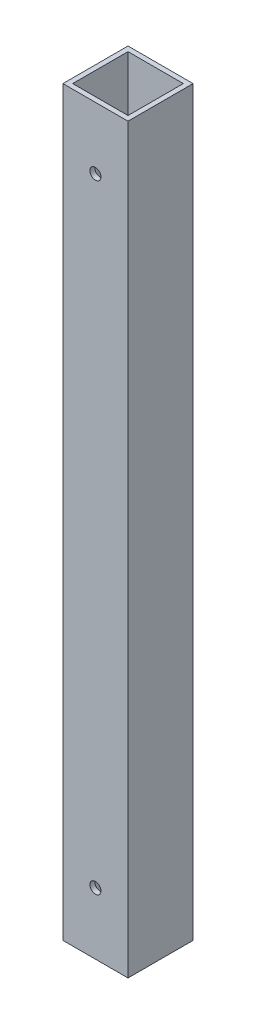
ISO-10303-21;
HEADER;
FILE_DESCRIPTION(('STEP AP214'),'2;1');
FILE_NAME('part.step','',(''),(''),'','','');
FILE_SCHEMA(('AUTOMOTIVE_DESIGN { 1 0 10303 214 1 1 1 1 }'));
ENDSEC;
DATA;
#1=APPLICATION_CONTEXT('core data for automotive mechanical design processes');
#2=APPLICATION_PROTOCOL_DEFINITION('international standard','automotive_design',2000,#1);
#3=PRODUCT_CONTEXT('',#1,'mechanical');
#4=PRODUCT('Part','Part','',(#3));
#5=PRODUCT_RELATED_PRODUCT_CATEGORY('part','',(#4));
#6=PRODUCT_DEFINITION_FORMATION('','',#4);
#7=PRODUCT_DEFINITION_CONTEXT('part definition',#1,'design');
#8=PRODUCT_DEFINITION('design','',#6,#7);
#9=PRODUCT_DEFINITION_SHAPE('','',#8);
#10=(LENGTH_UNIT() NAMED_UNIT(*) SI_UNIT(.MILLI.,.METRE.));
#11=(NAMED_UNIT(*) PLANE_ANGLE_UNIT() SI_UNIT($,.RADIAN.));
#12=(NAMED_UNIT(*) SI_UNIT($,.STERADIAN.) SOLID_ANGLE_UNIT());
#13=UNCERTAINTY_MEASURE_WITH_UNIT(LENGTH_MEASURE(1.E-05),#10,'distance_accuracy_value','');
#14=(GEOMETRIC_REPRESENTATION_CONTEXT(3) GLOBAL_UNCERTAINTY_ASSIGNED_CONTEXT((#13)) GLOBAL_UNIT_ASSIGNED_CONTEXT((#10,
#11,#12)) REPRESENTATION_CONTEXT('',''));
#15=CARTESIAN_POINT('',(0.,0.,0.));
#16=DIRECTION('',(0.,0.,1.));
#17=DIRECTION('',(1.,0.,0.));
#18=AXIS2_PLACEMENT_3D('',#15,#16,#17);
#19=CARTESIAN_POINT('',(0.,95.,-11.));
#20=DIRECTION('',(0.,0.,1.));
#21=DIRECTION('',(1.,0.,0.));
#22=AXIS2_PLACEMENT_3D('',#19,#20,#21);
#23=CYLINDRICAL_SURFACE('',#22,1.7);
#24=DIRECTION('',(0.,0.,1.));
#25=VECTOR('',#24,1.);
#26=CARTESIAN_POINT('',(1.7,95.,-11.));
#27=LINE('',#26,#25);
#28=CARTESIAN_POINT('',(1.7,95.,-10.));
#29=VERTEX_POINT('',#28);
#30=CARTESIAN_POINT('',(1.7,95.,-8.5));
#31=VERTEX_POINT('',#30);
#32=EDGE_CURVE('E9',#29,#31,#27,.T.);
#33=ORIENTED_EDGE('',*,*,#32,.F.);
#34=CARTESIAN_POINT('',(0.,95.,-10.));
#35=DIRECTION('',(0.,0.,1.));
#36=DIRECTION('',(1.,0.,0.));
#37=AXIS2_PLACEMENT_3D('',#34,#35,#36);
#38=CIRCLE('',#37,1.7);
#39=EDGE_CURVE('E134',#29,#29,#38,.T.);
#40=ORIENTED_EDGE('',*,*,#39,.F.);
#41=ORIENTED_EDGE('',*,*,#32,.T.);
#42=CARTESIAN_POINT('',(0.,95.,-8.5));
#43=DIRECTION('',(0.,0.,1.));
#44=DIRECTION('',(1.,0.,0.));
#45=AXIS2_PLACEMENT_3D('',#42,#43,#44);
#46=CIRCLE('',#45,1.7);
#47=EDGE_CURVE('E136',#31,#31,#46,.T.);
#48=ORIENTED_EDGE('',*,*,#47,.T.);
#49=EDGE_LOOP('',(#33,#40,#41,#48));
#50=FACE_BOUND('',#49,.T.);
#51=ADVANCED_FACE('F14',(#50),#23,.F.);
#52=CARTESIAN_POINT('',(0.,-95.,-11.));
#53=DIRECTION('',(0.,0.,1.));
#54=DIRECTION('',(1.,0.,0.));
#55=AXIS2_PLACEMENT_3D('',#52,#53,#54);
#56=CYLINDRICAL_SURFACE('',#55,1.7);
#57=DIRECTION('',(0.,0.,1.));
#58=VECTOR('',#57,1.);
#59=CARTESIAN_POINT('',(1.7,-95.,-11.));
#60=LINE('',#59,#58);
#61=CARTESIAN_POINT('',(1.7,-95.,-10.));
#62=VERTEX_POINT('',#61);
#63=CARTESIAN_POINT('',(1.7,-95.,-8.5));
#64=VERTEX_POINT('',#63);
#65=EDGE_CURVE('E25',#62,#64,#60,.T.);
#66=ORIENTED_EDGE('',*,*,#65,.F.);
#67=CARTESIAN_POINT('',(0.,-95.,-10.));
#68=DIRECTION('',(0.,0.,1.));
#69=DIRECTION('',(1.,0.,0.));
#70=AXIS2_PLACEMENT_3D('',#67,#68,#69);
#71=CIRCLE('',#70,1.7);
#72=EDGE_CURVE('E140',#62,#62,#71,.T.);
#73=ORIENTED_EDGE('',*,*,#72,.F.);
#74=ORIENTED_EDGE('',*,*,#65,.T.);
#75=CARTESIAN_POINT('',(0.,-95.,-8.5));
#76=DIRECTION('',(0.,0.,1.));
#77=DIRECTION('',(1.,0.,0.));
#78=AXIS2_PLACEMENT_3D('',#75,#76,#77);
#79=CIRCLE('',#78,1.7);
#80=EDGE_CURVE('E229',#64,#64,#79,.T.);
#81=ORIENTED_EDGE('',*,*,#80,.T.);
#82=EDGE_LOOP('',(#66,#73,#74,#81));
#83=FACE_BOUND('',#82,.T.);
#84=ADVANCED_FACE('F395',(#83),#56,.F.);
#85=CARTESIAN_POINT('',(0.,95.,-11.));
#86=DIRECTION('',(0.,0.,1.));
#87=DIRECTION('',(1.,0.,0.));
#88=AXIS2_PLACEMENT_3D('',#85,#86,#87);
#89=CYLINDRICAL_SURFACE('',#88,1.7);
#90=DIRECTION('',(0.,0.,1.));
#91=VECTOR('',#90,1.);
#92=CARTESIAN_POINT('',(1.7,95.,-11.));
#93=LINE('',#92,#91);
#94=CARTESIAN_POINT('',(1.7,95.,8.5));
#95=VERTEX_POINT('',#94);
#96=CARTESIAN_POINT('',(1.7,95.,10.));
#97=VERTEX_POINT('',#96);
#98=EDGE_CURVE('E193',#95,#97,#93,.T.);
#99=ORIENTED_EDGE('',*,*,#98,.F.);
#100=CARTESIAN_POINT('',(0.,95.,8.5));
#101=DIRECTION('',(0.,0.,1.));
#102=DIRECTION('',(1.,0.,0.));
#103=AXIS2_PLACEMENT_3D('',#100,#101,#102);
#104=CIRCLE('',#103,1.7);
#105=EDGE_CURVE('E199',#95,#95,#104,.T.);
#106=ORIENTED_EDGE('',*,*,#105,.F.);
#107=ORIENTED_EDGE('',*,*,#98,.T.);
#108=CARTESIAN_POINT('',(0.,95.,10.));
#109=DIRECTION('',(0.,0.,1.));
#110=DIRECTION('',(1.,0.,0.));
#111=AXIS2_PLACEMENT_3D('',#108,#109,#110);
#112=CIRCLE('',#111,1.7);
#113=EDGE_CURVE('E18',#97,#97,#112,.T.);
#114=ORIENTED_EDGE('',*,*,#113,.T.);
#115=EDGE_LOOP('',(#99,#106,#107,#114));
#116=FACE_BOUND('',#115,.T.);
#117=ADVANCED_FACE('F399',(#116),#89,.F.);
#118=CARTESIAN_POINT('',(0.,-95.,-11.));
#119=DIRECTION('',(0.,0.,1.));
#120=DIRECTION('',(1.,0.,0.));
#121=AXIS2_PLACEMENT_3D('',#118,#119,#120);
#122=CYLINDRICAL_SURFACE('',#121,1.7);
#123=DIRECTION('',(0.,0.,1.));
#124=VECTOR('',#123,1.);
#125=CARTESIAN_POINT('',(1.7,-95.,-11.));
#126=LINE('',#125,#124);
#127=CARTESIAN_POINT('',(1.7,-95.,8.5));
#128=VERTEX_POINT('',#127);
#129=CARTESIAN_POINT('',(1.7,-95.,10.));
#130=VERTEX_POINT('',#129);
#131=EDGE_CURVE('E208',#128,#130,#126,.T.);
#132=ORIENTED_EDGE('',*,*,#131,.F.);
#133=CARTESIAN_POINT('',(0.,-95.,8.5));
#134=DIRECTION('',(0.,0.,1.));
#135=DIRECTION('',(1.,0.,0.));
#136=AXIS2_PLACEMENT_3D('',#133,#134,#135);
#137=CIRCLE('',#136,1.7);
#138=EDGE_CURVE('E190',#128,#128,#137,.T.);
#139=ORIENTED_EDGE('',*,*,#138,.F.);
#140=ORIENTED_EDGE('',*,*,#131,.T.);
#141=CARTESIAN_POINT('',(0.,-95.,10.));
#142=DIRECTION('',(0.,0.,1.));
#143=DIRECTION('',(1.,0.,0.));
#144=AXIS2_PLACEMENT_3D('',#141,#142,#143);
#145=CIRCLE('',#144,1.7);
#146=EDGE_CURVE('E169',#130,#130,#145,.T.);
#147=ORIENTED_EDGE('',*,*,#146,.T.);
#148=EDGE_LOOP('',(#132,#139,#140,#147));
#149=FACE_BOUND('',#148,.T.);
#150=ADVANCED_FACE('F409',(#149),#122,.F.);
#151=CARTESIAN_POINT('',(-8.5,-114.5,-8.5));
#152=DIRECTION('',(1.,0.,0.));
#153=DIRECTION('',(0.,1.,0.));
#154=AXIS2_PLACEMENT_3D('',#151,#152,#153);
#155=PLANE('',#154);
#156=DIRECTION('',(0.,1.,0.));
#157=VECTOR('',#156,1.);
#158=CARTESIAN_POINT('',(-8.5,-114.5,8.5));
#159=LINE('',#158,#157);
#160=CARTESIAN_POINT('',(-8.5,-114.,8.5));
#161=VERTEX_POINT('',#160);
#162=CARTESIAN_POINT('',(-8.5,114.,8.5));
#163=VERTEX_POINT('',#162);
#164=EDGE_CURVE('E96',#161,#163,#159,.T.);
#165=ORIENTED_EDGE('',*,*,#164,.F.);
#166=DIRECTION('',(0.,0.,-1.));
#167=VECTOR('',#166,1.);
#168=CARTESIAN_POINT('',(-8.5,-114.,-9.25));
#169=LINE('',#168,#167);
#170=CARTESIAN_POINT('',(-8.5,-114.,-8.5));
#171=VERTEX_POINT('',#170);
#172=EDGE_CURVE('E163',#161,#171,#169,.T.);
#173=ORIENTED_EDGE('',*,*,#172,.T.);
#174=DIRECTION('',(0.,1.,0.));
#175=VECTOR('',#174,1.);
#176=CARTESIAN_POINT('',(-8.5,-114.5,-8.5));
#177=LINE('',#176,#175);
#178=CARTESIAN_POINT('',(-8.5,114.,-8.5));
#179=VERTEX_POINT('',#178);
#180=EDGE_CURVE('E226',#171,#179,#177,.T.);
#181=ORIENTED_EDGE('',*,*,#180,.T.);
#182=DIRECTION('',(0.,0.,-1.));
#183=VECTOR('',#182,1.);
#184=CARTESIAN_POINT('',(-8.5,114.,-9.25));
#185=LINE('',#184,#183);
#186=EDGE_CURVE('E158',#163,#179,#185,.T.);
#187=ORIENTED_EDGE('',*,*,#186,.F.);
#188=EDGE_LOOP('',(#165,#173,#181,#187));
#189=FACE_BOUND('',#188,.T.);
#190=ADVANCED_FACE('F404',(#189),#155,.T.);
#191=CARTESIAN_POINT('',(-8.5,-114.5,-8.5));
#192=DIRECTION('',(0.,0.,1.));
#193=DIRECTION('',(1.,0.,0.));
#194=AXIS2_PLACEMENT_3D('',#191,#192,#193);
#195=PLANE('',#194);
#196=ORIENTED_EDGE('',*,*,#47,.F.);
#197=EDGE_LOOP('',(#196));
#198=FACE_BOUND('',#197,.T.);
#199=ORIENTED_EDGE('',*,*,#80,.F.);
#200=EDGE_LOOP('',(#199));
#201=FACE_BOUND('',#200,.T.);
#202=ORIENTED_EDGE('',*,*,#180,.F.);
#203=DIRECTION('',(1.,0.,0.));
#204=VECTOR('',#203,1.);
#205=CARTESIAN_POINT('',(-9.25,-114.,-8.5));
#206=LINE('',#205,#204);
#207=CARTESIAN_POINT('',(8.5,-114.,-8.5));
#208=VERTEX_POINT('',#207);
#209=EDGE_CURVE('E168',#171,#208,#206,.T.);
#210=ORIENTED_EDGE('',*,*,#209,.T.);
#211=DIRECTION('',(0.,1.,0.));
#212=VECTOR('',#211,1.);
#213=CARTESIAN_POINT('',(8.5,-114.5,-8.5));
#214=LINE('',#213,#212);
#215=CARTESIAN_POINT('',(8.5,114.,-8.5));
#216=VERTEX_POINT('',#215);
#217=EDGE_CURVE('E203',#208,#216,#214,.T.);
#218=ORIENTED_EDGE('',*,*,#217,.T.);
#219=DIRECTION('',(1.,0.,0.));
#220=VECTOR('',#219,1.);
#221=CARTESIAN_POINT('',(-9.25,114.,-8.5));
#222=LINE('',#221,#220);
#223=EDGE_CURVE('E153',#179,#216,#222,.T.);
#224=ORIENTED_EDGE('',*,*,#223,.F.);
#225=EDGE_LOOP('',(#202,#210,#218,#224));
#226=FACE_BOUND('',#225,.T.);
#227=ADVANCED_FACE('F408',(#198,#201,#226),#195,.T.);
#228=CARTESIAN_POINT('',(8.5,-114.5,-8.5));
#229=DIRECTION('',(1.,0.,0.));
#230=DIRECTION('',(0.,1.,0.));
#231=AXIS2_PLACEMENT_3D('',#228,#229,#230);
#232=PLANE('',#231);
#233=DIRECTION('',(0.,0.,-1.));
#234=VECTOR('',#233,1.);
#235=CARTESIAN_POINT('',(8.5,114.,-9.25));
#236=LINE('',#235,#234);
#237=CARTESIAN_POINT('',(8.5,114.,8.5));
#238=VERTEX_POINT('',#237);
#239=EDGE_CURVE('E157',#238,#216,#236,.T.);
#240=ORIENTED_EDGE('',*,*,#239,.T.);
#241=ORIENTED_EDGE('',*,*,#217,.F.);
#242=DIRECTION('',(0.,0.,-1.));
#243=VECTOR('',#242,1.);
#244=CARTESIAN_POINT('',(8.5,-114.,-9.25));
#245=LINE('',#244,#243);
#246=CARTESIAN_POINT('',(8.5,-114.,8.5));
#247=VERTEX_POINT('',#246);
#248=EDGE_CURVE('E177',#247,#208,#245,.T.);
#249=ORIENTED_EDGE('',*,*,#248,.F.);
#250=DIRECTION('',(0.,1.,0.));
#251=VECTOR('',#250,1.);
#252=CARTESIAN_POINT('',(8.5,-114.5,8.5));
#253=LINE('',#252,#251);
#254=EDGE_CURVE('E80',#247,#238,#253,.T.);
#255=ORIENTED_EDGE('',*,*,#254,.T.);
#256=EDGE_LOOP('',(#240,#241,#249,#255));
#257=FACE_BOUND('',#256,.T.);
#258=ADVANCED_FACE('F462',(#257),#232,.F.);
#259=CARTESIAN_POINT('',(-8.5,-114.5,8.5));
#260=DIRECTION('',(0.,0.,1.));
#261=DIRECTION('',(1.,0.,0.));
#262=AXIS2_PLACEMENT_3D('',#259,#260,#261);
#263=PLANE('',#262);
#264=ORIENTED_EDGE('',*,*,#105,.T.);
#265=EDGE_LOOP('',(#264));
#266=FACE_BOUND('',#265,.T.);
#267=ORIENTED_EDGE('',*,*,#138,.T.);
#268=EDGE_LOOP('',(#267));
#269=FACE_BOUND('',#268,.T.);
#270=DIRECTION('',(1.,0.,0.));
#271=VECTOR('',#270,1.);
#272=CARTESIAN_POINT('',(-9.25,114.,8.5));
#273=LINE('',#272,#271);
#274=EDGE_CURVE('E159',#163,#238,#273,.T.);
#275=ORIENTED_EDGE('',*,*,#274,.T.);
#276=ORIENTED_EDGE('',*,*,#254,.F.);
#277=DIRECTION('',(1.,0.,0.));
#278=VECTOR('',#277,1.);
#279=CARTESIAN_POINT('',(-9.25,-114.,8.5));
#280=LINE('',#279,#278);
#281=EDGE_CURVE('E167',#161,#247,#280,.T.);
#282=ORIENTED_EDGE('',*,*,#281,.F.);
#283=ORIENTED_EDGE('',*,*,#164,.T.);
#284=EDGE_LOOP('',(#275,#276,#282,#283));
#285=FACE_BOUND('',#284,.T.);
#286=ADVANCED_FACE('F426',(#266,#269,#285),#263,.F.);
#287=CARTESIAN_POINT('',(10.,-114.,-10.));
#288=DIRECTION('',(1.,0.,0.));
#289=DIRECTION('',(0.,1.,0.));
#290=AXIS2_PLACEMENT_3D('',#287,#288,#289);
#291=PLANE('',#290);
#292=DIRECTION('',(0.,0.,1.));
#293=VECTOR('',#292,1.);
#294=CARTESIAN_POINT('',(10.,-114.,-10.));
#295=LINE('',#294,#293);
#296=CARTESIAN_POINT('',(10.,-114.,-10.));
#297=VERTEX_POINT('',#296);
#298=CARTESIAN_POINT('',(10.,-114.,10.));
#299=VERTEX_POINT('',#298);
#300=EDGE_CURVE('E178',#297,#299,#295,.T.);
#301=ORIENTED_EDGE('',*,*,#300,.F.);
#302=DIRECTION('',(0.,1.,0.));
#303=VECTOR('',#302,1.);
#304=CARTESIAN_POINT('',(10.,-114.,-10.));
#305=LINE('',#304,#303);
#306=CARTESIAN_POINT('',(10.,114.,-10.));
#307=VERTEX_POINT('',#306);
#308=EDGE_CURVE('E149',#297,#307,#305,.T.);
#309=ORIENTED_EDGE('',*,*,#308,.T.);
#310=DIRECTION('',(0.,0.,1.));
#311=VECTOR('',#310,1.);
#312=CARTESIAN_POINT('',(10.,114.,-10.));
#313=LINE('',#312,#311);
#314=CARTESIAN_POINT('',(10.,114.,10.));
#315=VERTEX_POINT('',#314);
#316=EDGE_CURVE('E162',#307,#315,#313,.T.);
#317=ORIENTED_EDGE('',*,*,#316,.T.);
#318=DIRECTION('',(0.,1.,0.));
#319=VECTOR('',#318,1.);
#320=CARTESIAN_POINT('',(10.,-114.,10.));
#321=LINE('',#320,#319);
#322=EDGE_CURVE('E235',#299,#315,#321,.T.);
#323=ORIENTED_EDGE('',*,*,#322,.F.);
#324=EDGE_LOOP('',(#301,#309,#317,#323));
#325=FACE_BOUND('',#324,.T.);
#326=ADVANCED_FACE('F270',(#325),#291,.T.);
#327=CARTESIAN_POINT('',(-10.,-114.,-10.));
#328=DIRECTION('',(0.,0.,1.));
#329=DIRECTION('',(1.,0.,0.));
#330=AXIS2_PLACEMENT_3D('',#327,#328,#329);
#331=PLANE('',#330);
#332=ORIENTED_EDGE('',*,*,#39,.T.);
#333=EDGE_LOOP('',(#332));
#334=FACE_BOUND('',#333,.T.);
#335=ORIENTED_EDGE('',*,*,#72,.T.);
#336=EDGE_LOOP('',(#335));
#337=FACE_BOUND('',#336,.T.);
#338=DIRECTION('',(1.,0.,0.));
#339=VECTOR('',#338,1.);
#340=CARTESIAN_POINT('',(-10.,114.,-10.));
#341=LINE('',#340,#339);
#342=CARTESIAN_POINT('',(-10.,114.,-10.));
#343=VERTEX_POINT('',#342);
#344=EDGE_CURVE('E260',#343,#307,#341,.T.);
#345=ORIENTED_EDGE('',*,*,#344,.T.);
#346=ORIENTED_EDGE('',*,*,#308,.F.);
#347=DIRECTION('',(1.,0.,0.));
#348=VECTOR('',#347,1.);
#349=CARTESIAN_POINT('',(-10.,-114.,-10.));
#350=LINE('',#349,#348);
#351=CARTESIAN_POINT('',(-10.,-114.,-10.));
#352=VERTEX_POINT('',#351);
#353=EDGE_CURVE('E184',#352,#297,#350,.T.);
#354=ORIENTED_EDGE('',*,*,#353,.F.);
#355=DIRECTION('',(0.,1.,0.));
#356=VECTOR('',#355,1.);
#357=CARTESIAN_POINT('',(-10.,-114.,-10.));
#358=LINE('',#357,#356);
#359=EDGE_CURVE('E194',#352,#343,#358,.T.);
#360=ORIENTED_EDGE('',*,*,#359,.T.);
#361=EDGE_LOOP('',(#345,#346,#354,#360));
#362=FACE_BOUND('',#361,.T.);
#363=ADVANCED_FACE('F16',(#334,#337,#362),#331,.F.);
#364=CARTESIAN_POINT('',(-10.,114.,-10.));
#365=DIRECTION('',(0.,1.,0.));
#366=DIRECTION('',(1.,0.,0.));
#367=AXIS2_PLACEMENT_3D('',#364,#365,#366);
#368=PLANE('',#367);
#369=ORIENTED_EDGE('',*,*,#274,.F.);
#370=ORIENTED_EDGE('',*,*,#186,.T.);
#371=ORIENTED_EDGE('',*,*,#223,.T.);
#372=ORIENTED_EDGE('',*,*,#239,.F.);
#373=EDGE_LOOP('',(#369,#370,#371,#372));
#374=FACE_BOUND('',#373,.T.);
#375=ORIENTED_EDGE('',*,*,#344,.F.);
#376=DIRECTION('',(0.,0.,1.));
#377=VECTOR('',#376,1.);
#378=CARTESIAN_POINT('',(-10.,114.,-10.));
#379=LINE('',#378,#377);
#380=CARTESIAN_POINT('',(-10.,114.,10.));
#381=VERTEX_POINT('',#380);
#382=EDGE_CURVE('E198',#343,#381,#379,.T.);
#383=ORIENTED_EDGE('',*,*,#382,.T.);
#384=DIRECTION('',(1.,0.,0.));
#385=VECTOR('',#384,1.);
#386=CARTESIAN_POINT('',(-10.,114.,10.));
#387=LINE('',#386,#385);
#388=EDGE_CURVE('E172',#381,#315,#387,.T.);
#389=ORIENTED_EDGE('',*,*,#388,.T.);
#390=ORIENTED_EDGE('',*,*,#316,.F.);
#391=EDGE_LOOP('',(#375,#383,#389,#390));
#392=FACE_BOUND('',#391,.T.);
#393=ADVANCED_FACE('F258',(#374,#392),#368,.T.);
#394=CARTESIAN_POINT('',(-10.,-114.,10.));
#395=DIRECTION('',(0.,0.,1.));
#396=DIRECTION('',(1.,0.,0.));
#397=AXIS2_PLACEMENT_3D('',#394,#395,#396);
#398=PLANE('',#397);
#399=ORIENTED_EDGE('',*,*,#113,.F.);
#400=EDGE_LOOP('',(#399));
#401=FACE_BOUND('',#400,.T.);
#402=ORIENTED_EDGE('',*,*,#146,.F.);
#403=EDGE_LOOP('',(#402));
#404=FACE_BOUND('',#403,.T.);
#405=DIRECTION('',(0.,1.,0.));
#406=VECTOR('',#405,1.);
#407=CARTESIAN_POINT('',(-10.,-114.,10.));
#408=LINE('',#407,#406);
#409=CARTESIAN_POINT('',(-10.,-114.,10.));
#410=VERTEX_POINT('',#409);
#411=EDGE_CURVE('E212',#410,#381,#408,.T.);
#412=ORIENTED_EDGE('',*,*,#411,.F.);
#413=DIRECTION('',(1.,0.,0.));
#414=VECTOR('',#413,1.);
#415=CARTESIAN_POINT('',(-10.,-114.,10.));
#416=LINE('',#415,#414);
#417=EDGE_CURVE('E182',#410,#299,#416,.T.);
#418=ORIENTED_EDGE('',*,*,#417,.T.);
#419=ORIENTED_EDGE('',*,*,#322,.T.);
#420=ORIENTED_EDGE('',*,*,#388,.F.);
#421=EDGE_LOOP('',(#412,#418,#419,#420));
#422=FACE_BOUND('',#421,.T.);
#423=ADVANCED_FACE('F253',(#401,#404,#422),#398,.T.);
#424=CARTESIAN_POINT('',(-10.,-114.,-10.));
#425=DIRECTION('',(0.,1.,0.));
#426=DIRECTION('',(1.,0.,0.));
#427=AXIS2_PLACEMENT_3D('',#424,#425,#426);
#428=PLANE('',#427);
#429=ORIENTED_EDGE('',*,*,#248,.T.);
#430=ORIENTED_EDGE('',*,*,#209,.F.);
#431=ORIENTED_EDGE('',*,*,#172,.F.);
#432=ORIENTED_EDGE('',*,*,#281,.T.);
#433=EDGE_LOOP('',(#429,#430,#431,#432));
#434=FACE_BOUND('',#433,.T.);
#435=ORIENTED_EDGE('',*,*,#300,.T.);
#436=ORIENTED_EDGE('',*,*,#417,.F.);
#437=DIRECTION('',(0.,0.,1.));
#438=VECTOR('',#437,1.);
#439=CARTESIAN_POINT('',(-10.,-114.,-10.));
#440=LINE('',#439,#438);
#441=EDGE_CURVE('E183',#352,#410,#440,.T.);
#442=ORIENTED_EDGE('',*,*,#441,.F.);
#443=ORIENTED_EDGE('',*,*,#353,.T.);
#444=EDGE_LOOP('',(#435,#436,#442,#443));
#445=FACE_BOUND('',#444,.T.);
#446=ADVANCED_FACE('F268',(#434,#445),#428,.F.);
#447=CARTESIAN_POINT('',(-10.,-114.,-10.));
#448=DIRECTION('',(1.,0.,0.));
#449=DIRECTION('',(0.,1.,0.));
#450=AXIS2_PLACEMENT_3D('',#447,#448,#449);
#451=PLANE('',#450);
#452=ORIENTED_EDGE('',*,*,#411,.T.);
#453=ORIENTED_EDGE('',*,*,#382,.F.);
#454=ORIENTED_EDGE('',*,*,#359,.F.);
#455=ORIENTED_EDGE('',*,*,#441,.T.);
#456=EDGE_LOOP('',(#452,#453,#454,#455));
#457=FACE_BOUND('',#456,.T.);
#458=ADVANCED_FACE('F249',(#457),#451,.F.);
#459=CLOSED_SHELL('',(#51,#84,#117,#150,#190,#227,#258,#286,#326,#363,#393,#423,#446,#458));
#460=MANIFOLD_SOLID_BREP('B1',#459);
#461=ADVANCED_BREP_SHAPE_REPRESENTATION('',(#18,#460),#14);
#462=SHAPE_DEFINITION_REPRESENTATION(#9,#461);
ENDSEC;
END-ISO-10303-21;
